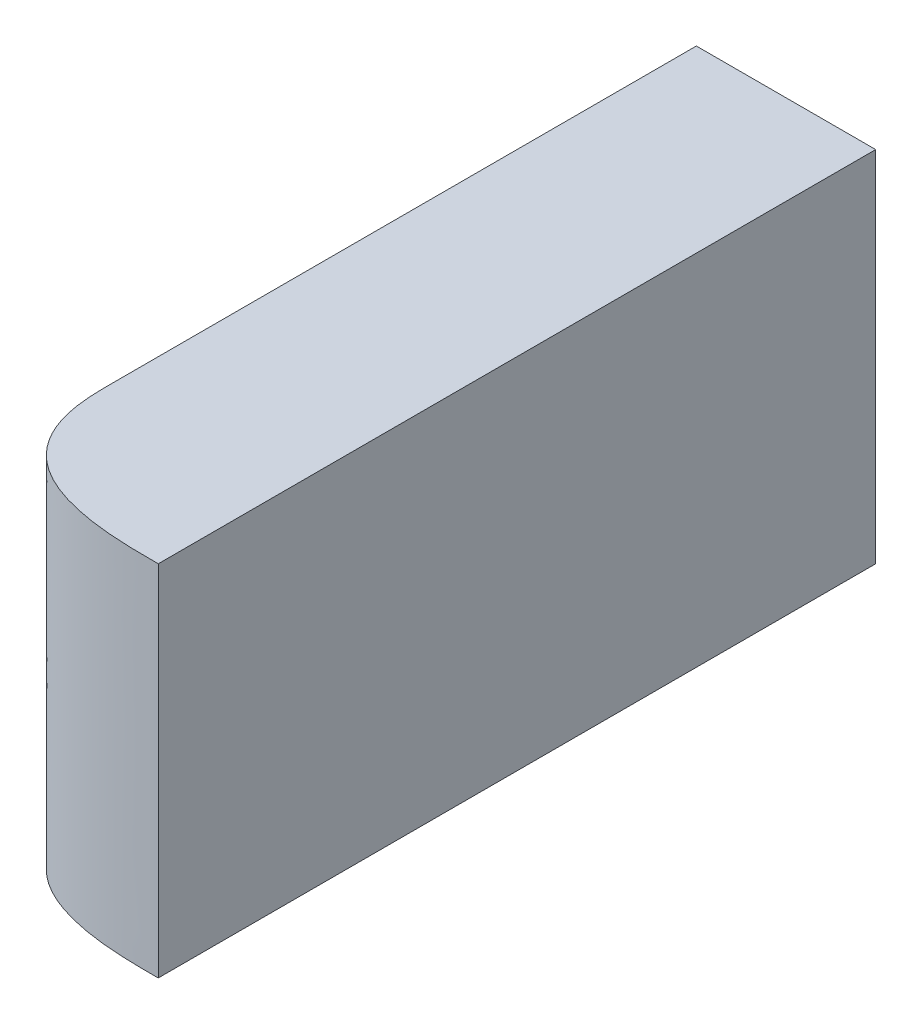
ISO-10303-21;
HEADER;
FILE_DESCRIPTION(('STEP AP214'),'2;1');
FILE_NAME('part.step','',(''),(''),'','','');
FILE_SCHEMA(('AUTOMOTIVE_DESIGN { 1 0 10303 214 1 1 1 1 }'));
ENDSEC;
DATA;
#1=APPLICATION_CONTEXT('core data for automotive mechanical design processes');
#2=APPLICATION_PROTOCOL_DEFINITION('international standard','automotive_design',2000,#1);
#3=PRODUCT_CONTEXT('',#1,'mechanical');
#4=PRODUCT('Part','Part','',(#3));
#5=PRODUCT_RELATED_PRODUCT_CATEGORY('part','',(#4));
#6=PRODUCT_DEFINITION_FORMATION('','',#4);
#7=PRODUCT_DEFINITION_CONTEXT('part definition',#1,'design');
#8=PRODUCT_DEFINITION('design','',#6,#7);
#9=PRODUCT_DEFINITION_SHAPE('','',#8);
#10=(LENGTH_UNIT() NAMED_UNIT(*) SI_UNIT(.MILLI.,.METRE.));
#11=(NAMED_UNIT(*) PLANE_ANGLE_UNIT() SI_UNIT($,.RADIAN.));
#12=(NAMED_UNIT(*) SI_UNIT($,.STERADIAN.) SOLID_ANGLE_UNIT());
#13=UNCERTAINTY_MEASURE_WITH_UNIT(LENGTH_MEASURE(1.E-05),#10,'distance_accuracy_value','');
#14=(GEOMETRIC_REPRESENTATION_CONTEXT(3) GLOBAL_UNCERTAINTY_ASSIGNED_CONTEXT((#13)) GLOBAL_UNIT_ASSIGNED_CONTEXT((#10,
#11,#12)) REPRESENTATION_CONTEXT('',''));
#15=CARTESIAN_POINT('',(0.,0.,0.));
#16=DIRECTION('',(0.,0.,1.));
#17=DIRECTION('',(1.,0.,0.));
#18=AXIS2_PLACEMENT_3D('',#15,#16,#17);
#19=CARTESIAN_POINT('',(12.5,55.,50.));
#20=CARTESIAN_POINT('',(12.5,35.0000000001908,50.));
#21=CARTESIAN_POINT('',(12.5,15.,50.));
#22=CARTESIAN_POINT('',(12.5,-5.,50.));
#23=CARTESIAN_POINT('',(8.29504871165135,55.,50.));
#24=CARTESIAN_POINT('',(8.29504871165135,35.0000000001908,50.));
#25=CARTESIAN_POINT('',(8.29504871165135,15.,50.));
#26=CARTESIAN_POINT('',(8.29504871165135,-5.,50.));
#27=CARTESIAN_POINT('',(4.09009742330269,55.,50.));
#28=CARTESIAN_POINT('',(4.09009742330269,35.0000000001908,50.));
#29=CARTESIAN_POINT('',(4.09009742330269,15.,50.));
#30=CARTESIAN_POINT('',(4.09009742330269,-5.,50.));
#31=CARTESIAN_POINT('',(-5.17766952966368,55.,48.6638560401875));
#32=CARTESIAN_POINT('',(-5.17766952966368,35.0000000001908,48.6638560401875));
#33=CARTESIAN_POINT('',(-5.17766952966368,15.,48.6638560401875));
#34=CARTESIAN_POINT('',(-5.17766952966368,-5.,48.6638560401875));
#35=CARTESIAN_POINT('',(-10.7077020040979,55.,44.5412606318477));
#36=CARTESIAN_POINT('',(-10.7077020040979,35.0000000001908,44.5412606318477));
#37=CARTESIAN_POINT('',(-10.7077020040979,15.,44.5412606318477));
#38=CARTESIAN_POINT('',(-10.7077020040979,-5.,44.5412606318477));
#39=CARTESIAN_POINT('',(-12.5,55.,37.6322137749808));
#40=CARTESIAN_POINT('',(-12.5,35.0000000001908,37.6322137749808));
#41=CARTESIAN_POINT('',(-12.5,15.,37.6322137749808));
#42=CARTESIAN_POINT('',(-12.5,-5.,37.6322137749808));
#43=CARTESIAN_POINT('',(-12.5,55.,34.4974558953877));
#44=CARTESIAN_POINT('',(-12.5,35.0000000001908,34.4974558953877));
#45=CARTESIAN_POINT('',(-12.5,15.,34.4974558953877));
#46=CARTESIAN_POINT('',(-12.5,-5.,34.4974558953877));
#47=CARTESIAN_POINT('',(-12.5,55.,31.3626980157946));
#48=CARTESIAN_POINT('',(-12.5,35.0000000001908,31.3626980157946));
#49=CARTESIAN_POINT('',(-12.5,15.,31.3626980157946));
#50=CARTESIAN_POINT('',(-12.5,-5.,31.3626980157946));
#51=B_SPLINE_SURFACE_WITH_KNOTS('',5,3,((#19,#20,#21,#22),(#23,#24,#25,#26),(#27,#28,#29,#30),
(#31,#32,#33,#34),(#35,#36,#37,#38),(#39,#40,#41,#42),(#43,#44,#45,#46),(#47,#48,#49,#50)),
.UNSPECIFIED.,.F.,.F.,.F.,(6,2,6),(4,4),(0.,0.5,1.),(-0.005,0.055),.UNSPECIFIED.);
#52=CARTESIAN_POINT('',(-12.5,55.,31.3626980157946));
#53=CARTESIAN_POINT('',(-12.5,35.0000000001908,31.3626980157946));
#54=CARTESIAN_POINT('',(-12.5,15.,31.3626980157946));
#55=CARTESIAN_POINT('',(-12.5,-5.,31.3626980157946));
#56=B_SPLINE_CURVE_WITH_KNOTS('',3,(#52,#53,#54,#55),.UNSPECIFIED.,.F.,.F.,(4,4),(-0.005,0.055),.UNSPECIFIED.);
#57=CARTESIAN_POINT('',(-12.5,50.,31.3626980157946));
#58=VERTEX_POINT('',#57);
#59=CARTESIAN_POINT('',(-12.5,0.,31.3626980157946));
#60=VERTEX_POINT('',#59);
#61=EDGE_CURVE('E115',#58,#60,#56,.T.);
#62=CARTESIAN_POINT('',(-12.5,0.,31.3626980157946));
#63=CARTESIAN_POINT('',(-12.5,0.,34.4974558953877));
#64=CARTESIAN_POINT('',(-12.5,0.,37.6322137749808));
#65=CARTESIAN_POINT('',(-10.7077020040979,0.,44.5412606318477));
#66=CARTESIAN_POINT('',(-5.17766952966368,0.,48.6638560401875));
#67=CARTESIAN_POINT('',(4.09009742330269,0.,50.));
#68=CARTESIAN_POINT('',(8.29504871165135,0.,50.));
#69=CARTESIAN_POINT('',(12.5,0.,50.));
#70=B_SPLINE_CURVE_WITH_KNOTS('',5,(#62,#63,#64,#65,#66,#67,#68,#69),.UNSPECIFIED.,.F.,.F.,(6,2,
6),(0.,0.5,1.),.UNSPECIFIED.);
#71=CARTESIAN_POINT('',(12.5,0.,50.));
#72=VERTEX_POINT('',#71);
#73=EDGE_CURVE('E57',#72,#60,#70,.F.);
#74=CARTESIAN_POINT('',(12.5,-5.,50.));
#75=CARTESIAN_POINT('',(12.5,15.,50.));
#76=CARTESIAN_POINT('',(12.5,35.0000000001908,50.));
#77=CARTESIAN_POINT('',(12.5,55.,50.));
#78=B_SPLINE_CURVE_WITH_KNOTS('',3,(#74,#75,#76,#77),.UNSPECIFIED.,.F.,.F.,(4,4),(-0.005,0.055),.UNSPECIFIED.);
#79=CARTESIAN_POINT('',(12.5,50.,50.));
#80=VERTEX_POINT('',#79);
#81=EDGE_CURVE('E119',#80,#72,#78,.F.);
#82=CARTESIAN_POINT('',(12.5,50.,50.));
#83=CARTESIAN_POINT('',(8.29504871165135,50.,50.));
#84=CARTESIAN_POINT('',(4.09009742330269,50.,50.));
#85=CARTESIAN_POINT('',(-5.17766952966368,50.,48.6638560401875));
#86=CARTESIAN_POINT('',(-10.7077020040979,50.,44.5412606318477));
#87=CARTESIAN_POINT('',(-12.5,50.,37.6322137749808));
#88=CARTESIAN_POINT('',(-12.5,50.,34.4974558953877));
#89=CARTESIAN_POINT('',(-12.5,50.,31.3626980157946));
#90=B_SPLINE_CURVE_WITH_KNOTS('',5,(#82,#83,#84,#85,#86,#87,#88,#89),.UNSPECIFIED.,.F.,.F.,(6,2,
6),(0.,0.5,1.),.UNSPECIFIED.);
#91=EDGE_CURVE('E11',#58,#80,#90,.F.);
#92=ORIENTED_EDGE('',*,*,#61,.T.);
#93=ORIENTED_EDGE('',*,*,#73,.F.);
#94=ORIENTED_EDGE('',*,*,#81,.F.);
#95=ORIENTED_EDGE('',*,*,#91,.F.);
#96=EDGE_LOOP('',(#92,#93,#94,#95));
#97=FACE_BOUND('',#96,.T.);
#98=ADVANCED_FACE('F43',(#97),#51,.T.);
#99=CARTESIAN_POINT('',(-12.5,50.,50.));
#100=DIRECTION('',(1.,0.,0.));
#101=DIRECTION('',(0.,0.,-1.));
#102=AXIS2_PLACEMENT_3D('',#99,#100,#101);
#103=PLANE('',#102);
#104=ORIENTED_EDGE('',*,*,#61,.F.);
#105=DIRECTION('',(0.,0.,1.));
#106=VECTOR('',#105,1.);
#107=CARTESIAN_POINT('',(-12.5,50.,50.));
#108=LINE('',#107,#106);
#109=CARTESIAN_POINT('',(-12.5,50.,-50.));
#110=VERTEX_POINT('',#109);
#111=EDGE_CURVE('E101',#110,#58,#108,.T.);
#112=ORIENTED_EDGE('',*,*,#111,.F.);
#113=DIRECTION('',(0.,-1.,0.));
#114=VECTOR('',#113,1.);
#115=CARTESIAN_POINT('',(-12.5,50.,-50.));
#116=LINE('',#115,#114);
#117=CARTESIAN_POINT('',(-12.5,0.,-50.));
#118=VERTEX_POINT('',#117);
#119=EDGE_CURVE('E96',#110,#118,#116,.T.);
#120=ORIENTED_EDGE('',*,*,#119,.T.);
#121=DIRECTION('',(0.,0.,1.));
#122=VECTOR('',#121,1.);
#123=CARTESIAN_POINT('',(-12.5,0.,50.));
#124=LINE('',#123,#122);
#125=EDGE_CURVE('E110',#118,#60,#124,.T.);
#126=ORIENTED_EDGE('',*,*,#125,.T.);
#127=EDGE_LOOP('',(#104,#112,#120,#126));
#128=FACE_BOUND('',#127,.T.);
#129=ADVANCED_FACE('F139',(#128),#103,.F.);
#130=CARTESIAN_POINT('',(12.5,50.,50.));
#131=DIRECTION('',(-1.,0.,0.));
#132=DIRECTION('',(0.,0.,1.));
#133=AXIS2_PLACEMENT_3D('',#130,#131,#132);
#134=PLANE('',#133);
#135=DIRECTION('',(0.,0.,-1.));
#136=VECTOR('',#135,1.);
#137=CARTESIAN_POINT('',(12.5,0.,50.));
#138=LINE('',#137,#136);
#139=CARTESIAN_POINT('',(12.5,0.,-50.));
#140=VERTEX_POINT('',#139);
#141=EDGE_CURVE('E113',#72,#140,#138,.T.);
#142=ORIENTED_EDGE('',*,*,#141,.T.);
#143=DIRECTION('',(0.,-1.,0.));
#144=VECTOR('',#143,1.);
#145=CARTESIAN_POINT('',(12.5,50.,-50.));
#146=LINE('',#145,#144);
#147=CARTESIAN_POINT('',(12.5,50.,-50.));
#148=VERTEX_POINT('',#147);
#149=EDGE_CURVE('E93',#148,#140,#146,.T.);
#150=ORIENTED_EDGE('',*,*,#149,.F.);
#151=DIRECTION('',(0.,0.,-1.));
#152=VECTOR('',#151,1.);
#153=CARTESIAN_POINT('',(12.5,50.,50.));
#154=LINE('',#153,#152);
#155=EDGE_CURVE('E102',#80,#148,#154,.T.);
#156=ORIENTED_EDGE('',*,*,#155,.F.);
#157=ORIENTED_EDGE('',*,*,#81,.T.);
#158=EDGE_LOOP('',(#142,#150,#156,#157));
#159=FACE_BOUND('',#158,.T.);
#160=ADVANCED_FACE('F112',(#159),#134,.F.);
#161=CARTESIAN_POINT('',(-12.5,50.,-50.));
#162=DIRECTION('',(0.,0.,1.));
#163=DIRECTION('',(1.,0.,0.));
#164=AXIS2_PLACEMENT_3D('',#161,#162,#163);
#165=PLANE('',#164);
#166=DIRECTION('',(-1.,0.,0.));
#167=VECTOR('',#166,1.);
#168=CARTESIAN_POINT('',(-12.5,0.,-50.));
#169=LINE('',#168,#167);
#170=EDGE_CURVE('E186',#140,#118,#169,.T.);
#171=ORIENTED_EDGE('',*,*,#170,.T.);
#172=ORIENTED_EDGE('',*,*,#119,.F.);
#173=DIRECTION('',(-1.,0.,0.));
#174=VECTOR('',#173,1.);
#175=CARTESIAN_POINT('',(-12.5,50.,-50.));
#176=LINE('',#175,#174);
#177=EDGE_CURVE('E89',#148,#110,#176,.T.);
#178=ORIENTED_EDGE('',*,*,#177,.F.);
#179=ORIENTED_EDGE('',*,*,#149,.T.);
#180=EDGE_LOOP('',(#171,#172,#178,#179));
#181=FACE_BOUND('',#180,.T.);
#182=ADVANCED_FACE('F91',(#181),#165,.F.);
#183=CARTESIAN_POINT('',(0.,50.,0.));
#184=DIRECTION('',(0.,-1.,0.));
#185=DIRECTION('',(0.,0.,-1.));
#186=AXIS2_PLACEMENT_3D('',#183,#184,#185);
#187=PLANE('',#186);
#188=ORIENTED_EDGE('',*,*,#111,.T.);
#189=ORIENTED_EDGE('',*,*,#91,.T.);
#190=ORIENTED_EDGE('',*,*,#155,.T.);
#191=ORIENTED_EDGE('',*,*,#177,.T.);
#192=EDGE_LOOP('',(#188,#189,#190,#191));
#193=FACE_BOUND('',#192,.T.);
#194=ADVANCED_FACE('F105',(#193),#187,.F.);
#195=CARTESIAN_POINT('',(0.,0.,0.));
#196=DIRECTION('',(0.,-1.,0.));
#197=DIRECTION('',(0.,0.,-1.));
#198=AXIS2_PLACEMENT_3D('',#195,#196,#197);
#199=PLANE('',#198);
#200=ORIENTED_EDGE('',*,*,#141,.F.);
#201=ORIENTED_EDGE('',*,*,#73,.T.);
#202=ORIENTED_EDGE('',*,*,#125,.F.);
#203=ORIENTED_EDGE('',*,*,#170,.F.);
#204=EDGE_LOOP('',(#200,#201,#202,#203));
#205=FACE_BOUND('',#204,.T.);
#206=ADVANCED_FACE('F128',(#205),#199,.T.);
#207=CLOSED_SHELL('',(#98,#129,#160,#182,#194,#206));
#208=MANIFOLD_SOLID_BREP('B2',#207);
#209=ADVANCED_BREP_SHAPE_REPRESENTATION('',(#18,#208),#14);
#210=SHAPE_DEFINITION_REPRESENTATION(#9,#209);
ENDSEC;
END-ISO-10303-21;
